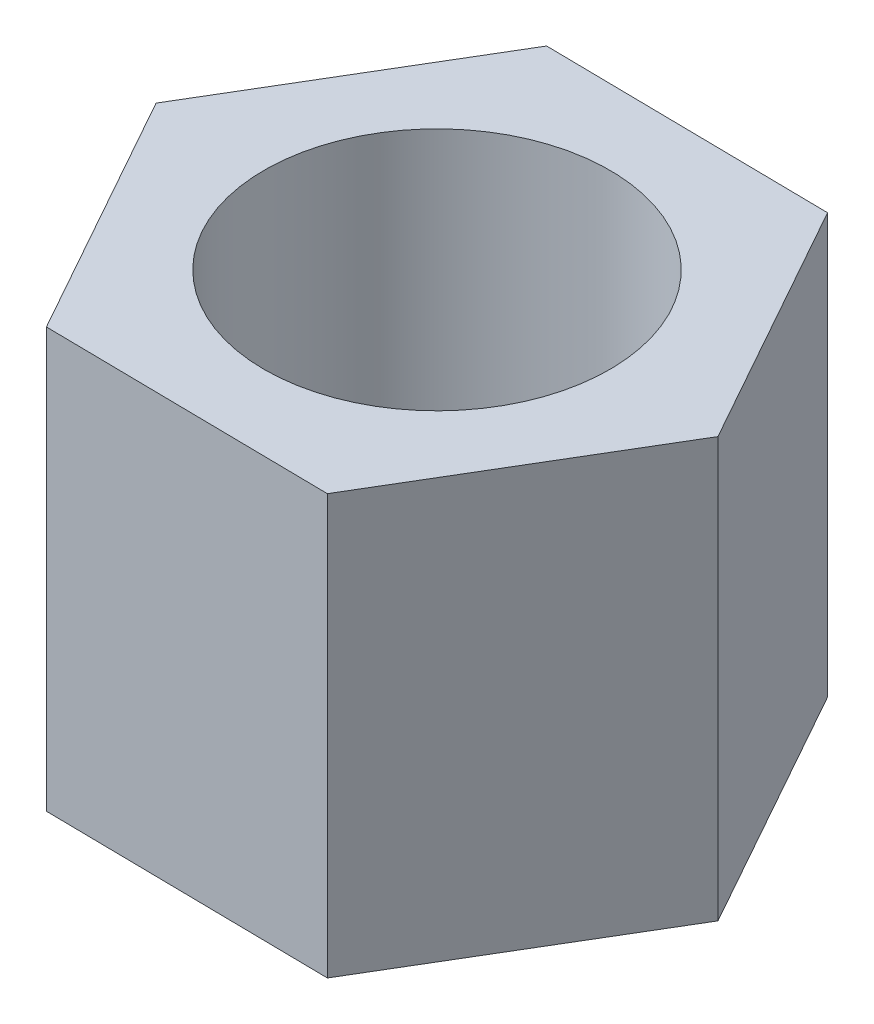
ISO-10303-21;
HEADER;
FILE_DESCRIPTION(('STEP AP214'),'2;1');
FILE_NAME('part.step','',(''),(''),'','','');
FILE_SCHEMA(('AUTOMOTIVE_DESIGN { 1 0 10303 214 1 1 1 1 }'));
ENDSEC;
DATA;
#1=APPLICATION_CONTEXT('core data for automotive mechanical design processes');
#2=APPLICATION_PROTOCOL_DEFINITION('international standard','automotive_design',2000,#1);
#3=PRODUCT_CONTEXT('',#1,'mechanical');
#4=PRODUCT('Part','Part','',(#3));
#5=PRODUCT_RELATED_PRODUCT_CATEGORY('part','',(#4));
#6=PRODUCT_DEFINITION_FORMATION('','',#4);
#7=PRODUCT_DEFINITION_CONTEXT('part definition',#1,'design');
#8=PRODUCT_DEFINITION('design','',#6,#7);
#9=PRODUCT_DEFINITION_SHAPE('','',#8);
#10=(LENGTH_UNIT() NAMED_UNIT(*) SI_UNIT(.MILLI.,.METRE.));
#11=(NAMED_UNIT(*) PLANE_ANGLE_UNIT() SI_UNIT($,.RADIAN.));
#12=(NAMED_UNIT(*) SI_UNIT($,.STERADIAN.) SOLID_ANGLE_UNIT());
#13=UNCERTAINTY_MEASURE_WITH_UNIT(LENGTH_MEASURE(1.E-05),#10,'distance_accuracy_value','');
#14=(GEOMETRIC_REPRESENTATION_CONTEXT(3) GLOBAL_UNCERTAINTY_ASSIGNED_CONTEXT((#13)) GLOBAL_UNIT_ASSIGNED_CONTEXT((#10,
#11,#12)) REPRESENTATION_CONTEXT('',''));
#15=CARTESIAN_POINT('',(0.,0.,0.));
#16=DIRECTION('',(0.,0.,1.));
#17=DIRECTION('',(1.,0.,0.));
#18=AXIS2_PLACEMENT_3D('',#15,#16,#17);
#19=CARTESIAN_POINT('',(-5.91090155943536,17.,9.91940401879054));
#20=DIRECTION('',(0.013794823423949,0.,-0.999904846896294));
#21=DIRECTION('',(-0.999904846896295,0.,-0.013794823423949));
#22=AXIS2_PLACEMENT_3D('',#19,#20,#21);
#23=PLANE('',#22);
#24=DIRECTION('',(0.999904846896295,0.,0.013794823423949));
#25=VECTOR('',#24,1.);
#26=CARTESIAN_POINT('',(-5.91090155943536,0.,9.91940401879054));
#27=LINE('',#26,#25);
#28=CARTESIAN_POINT('',(-5.91090155943536,0.,9.91940401879054));
#29=VERTEX_POINT('',#28);
#30=CARTESIAN_POINT('',(5.63500509095638,0.,10.0786929191353));
#31=VERTEX_POINT('',#30);
#32=EDGE_CURVE('E117',#29,#31,#27,.T.);
#33=ORIENTED_EDGE('',*,*,#32,.T.);
#34=DIRECTION('',(0.,-1.,0.));
#35=VECTOR('',#34,1.);
#36=CARTESIAN_POINT('',(5.63500509095638,17.,10.0786929191353));
#37=LINE('',#36,#35);
#38=CARTESIAN_POINT('',(5.63500509095638,17.,10.0786929191353));
#39=VERTEX_POINT('',#38);
#40=EDGE_CURVE('E11',#39,#31,#37,.T.);
#41=ORIENTED_EDGE('',*,*,#40,.F.);
#42=DIRECTION('',(0.999904846896295,0.,0.013794823423949));
#43=VECTOR('',#42,1.);
#44=CARTESIAN_POINT('',(-5.91090155943536,17.,9.91940401879054));
#45=LINE('',#44,#43);
#46=CARTESIAN_POINT('',(-5.91090155943536,17.,9.91940401879054));
#47=VERTEX_POINT('',#46);
#48=EDGE_CURVE('E128',#47,#39,#45,.T.);
#49=ORIENTED_EDGE('',*,*,#48,.F.);
#50=DIRECTION('',(0.,-1.,0.));
#51=VECTOR('',#50,1.);
#52=CARTESIAN_POINT('',(-5.91090155943536,17.,9.91940401879054));
#53=LINE('',#52,#51);
#54=EDGE_CURVE('E113',#47,#29,#53,.T.);
#55=ORIENTED_EDGE('',*,*,#54,.T.);
#56=EDGE_LOOP('',(#33,#41,#49,#55));
#57=FACE_BOUND('',#56,.T.);
#58=ADVANCED_FACE('F33',(#57),#23,.F.);
#59=CARTESIAN_POINT('',(5.63500509095638,17.,10.0786929191353));
#60=DIRECTION('',(-0.859045587067407,0.,-0.511899090974007));
#61=DIRECTION('',(-0.511899090974007,0.,0.859045587067407));
#62=AXIS2_PLACEMENT_3D('',#59,#60,#61);
#63=PLANE('',#62);
#64=DIRECTION('',(0.511899090974007,0.,-0.859045587067407));
#65=VECTOR('',#64,1.);
#66=CARTESIAN_POINT('',(5.63500509095638,0.,10.0786929191353));
#67=LINE('',#66,#65);
#68=CARTESIAN_POINT('',(11.5459066503917,0.,0.159288900344801));
#69=VERTEX_POINT('',#68);
#70=EDGE_CURVE('E120',#31,#69,#67,.T.);
#71=ORIENTED_EDGE('',*,*,#70,.T.);
#72=DIRECTION('',(0.,-1.,0.));
#73=VECTOR('',#72,1.);
#74=CARTESIAN_POINT('',(11.5459066503917,17.,0.159288900344801));
#75=LINE('',#74,#73);
#76=CARTESIAN_POINT('',(11.5459066503917,17.,0.159288900344801));
#77=VERTEX_POINT('',#76);
#78=EDGE_CURVE('E41',#77,#69,#75,.T.);
#79=ORIENTED_EDGE('',*,*,#78,.F.);
#80=DIRECTION('',(0.511899090974007,0.,-0.859045587067407));
#81=VECTOR('',#80,1.);
#82=CARTESIAN_POINT('',(5.63500509095638,17.,10.0786929191353));
#83=LINE('',#82,#81);
#84=EDGE_CURVE('E86',#39,#77,#83,.T.);
#85=ORIENTED_EDGE('',*,*,#84,.F.);
#86=ORIENTED_EDGE('',*,*,#40,.T.);
#87=EDGE_LOOP('',(#71,#79,#85,#86));
#88=FACE_BOUND('',#87,.T.);
#89=ADVANCED_FACE('F153',(#88),#63,.F.);
#90=CARTESIAN_POINT('',(11.5459066503917,17.,0.159288900344801));
#91=DIRECTION('',(-0.872840410491355,0.,0.488005755922287));
#92=DIRECTION('',(0.488005755922287,0.,0.872840410491355));
#93=AXIS2_PLACEMENT_3D('',#90,#91,#92);
#94=PLANE('',#93);
#95=DIRECTION('',(-0.488005755922287,0.,-0.872840410491355));
#96=VECTOR('',#95,1.);
#97=CARTESIAN_POINT('',(11.5459066503917,0.,0.159288900344801));
#98=LINE('',#97,#96);
#99=CARTESIAN_POINT('',(5.91090155943536,0.,-9.91940401879055));
#100=VERTEX_POINT('',#99);
#101=EDGE_CURVE('E123',#69,#100,#98,.T.);
#102=ORIENTED_EDGE('',*,*,#101,.T.);
#103=DIRECTION('',(0.,-1.,0.));
#104=VECTOR('',#103,1.);
#105=CARTESIAN_POINT('',(5.91090155943536,17.,-9.91940401879055));
#106=LINE('',#105,#104);
#107=CARTESIAN_POINT('',(5.91090155943536,17.,-9.91940401879055));
#108=VERTEX_POINT('',#107);
#109=EDGE_CURVE('E108',#108,#100,#106,.T.);
#110=ORIENTED_EDGE('',*,*,#109,.F.);
#111=DIRECTION('',(-0.488005755922287,0.,-0.872840410491355));
#112=VECTOR('',#111,1.);
#113=CARTESIAN_POINT('',(11.5459066503917,17.,0.159288900344801));
#114=LINE('',#113,#112);
#115=EDGE_CURVE('E99',#77,#108,#114,.T.);
#116=ORIENTED_EDGE('',*,*,#115,.F.);
#117=ORIENTED_EDGE('',*,*,#78,.T.);
#118=EDGE_LOOP('',(#102,#110,#116,#117));
#119=FACE_BOUND('',#118,.T.);
#120=ADVANCED_FACE('F134',(#119),#94,.F.);
#121=CARTESIAN_POINT('',(5.91090155943536,17.,-9.91940401879055));
#122=DIRECTION('',(-0.0137948234239488,0.,0.999904846896294));
#123=DIRECTION('',(0.999904846896295,0.,0.0137948234239488));
#124=AXIS2_PLACEMENT_3D('',#121,#122,#123);
#125=PLANE('',#124);
#126=DIRECTION('',(-0.999904846896295,0.,-0.0137948234239488));
#127=VECTOR('',#126,1.);
#128=CARTESIAN_POINT('',(5.91090155943536,0.,-9.91940401879055));
#129=LINE('',#128,#127);
#130=CARTESIAN_POINT('',(-5.63500509095639,0.,-10.0786929191354));
#131=VERTEX_POINT('',#130);
#132=EDGE_CURVE('E107',#100,#131,#129,.T.);
#133=ORIENTED_EDGE('',*,*,#132,.T.);
#134=DIRECTION('',(0.,-1.,0.));
#135=VECTOR('',#134,1.);
#136=CARTESIAN_POINT('',(-5.63500509095639,17.,-10.0786929191354));
#137=LINE('',#136,#135);
#138=CARTESIAN_POINT('',(-5.63500509095639,17.,-10.0786929191354));
#139=VERTEX_POINT('',#138);
#140=EDGE_CURVE('E104',#139,#131,#137,.T.);
#141=ORIENTED_EDGE('',*,*,#140,.F.);
#142=DIRECTION('',(-0.999904846896295,0.,-0.0137948234239488));
#143=VECTOR('',#142,1.);
#144=CARTESIAN_POINT('',(5.91090155943536,17.,-9.91940401879055));
#145=LINE('',#144,#143);
#146=EDGE_CURVE('E93',#108,#139,#145,.T.);
#147=ORIENTED_EDGE('',*,*,#146,.F.);
#148=ORIENTED_EDGE('',*,*,#109,.T.);
#149=EDGE_LOOP('',(#133,#141,#147,#148));
#150=FACE_BOUND('',#149,.T.);
#151=ADVANCED_FACE('F105',(#150),#125,.F.);
#152=CARTESIAN_POINT('',(-5.63500509095639,17.,-10.0786929191354));
#153=DIRECTION('',(0.859045587067406,0.,0.511899090974008));
#154=DIRECTION('',(0.511899090974008,0.,-0.859045587067406));
#155=AXIS2_PLACEMENT_3D('',#152,#153,#154);
#156=PLANE('',#155);
#157=DIRECTION('',(-0.511899090974008,0.,0.859045587067406));
#158=VECTOR('',#157,1.);
#159=CARTESIAN_POINT('',(-5.63500509095639,0.,-10.0786929191354));
#160=LINE('',#159,#158);
#161=CARTESIAN_POINT('',(-11.5459066503917,0.,-0.159288900344807));
#162=VERTEX_POINT('',#161);
#163=EDGE_CURVE('E72',#131,#162,#160,.T.);
#164=ORIENTED_EDGE('',*,*,#163,.T.);
#165=DIRECTION('',(0.,-1.,0.));
#166=VECTOR('',#165,1.);
#167=CARTESIAN_POINT('',(-11.5459066503917,17.,-0.159288900344807));
#168=LINE('',#167,#166);
#169=CARTESIAN_POINT('',(-11.5459066503917,17.,-0.159288900344807));
#170=VERTEX_POINT('',#169);
#171=EDGE_CURVE('E109',#170,#162,#168,.T.);
#172=ORIENTED_EDGE('',*,*,#171,.F.);
#173=DIRECTION('',(-0.511899090974008,0.,0.859045587067406));
#174=VECTOR('',#173,1.);
#175=CARTESIAN_POINT('',(-5.63500509095639,17.,-10.0786929191354));
#176=LINE('',#175,#174);
#177=EDGE_CURVE('E97',#139,#170,#176,.T.);
#178=ORIENTED_EDGE('',*,*,#177,.F.);
#179=ORIENTED_EDGE('',*,*,#140,.T.);
#180=EDGE_LOOP('',(#164,#172,#178,#179));
#181=FACE_BOUND('',#180,.T.);
#182=ADVANCED_FACE('F111',(#181),#156,.F.);
#183=CARTESIAN_POINT('',(-11.5459066503917,17.,-0.159288900344807));
#184=DIRECTION('',(0.872840410491355,0.,-0.488005755922287));
#185=DIRECTION('',(-0.488005755922287,0.,-0.872840410491355));
#186=AXIS2_PLACEMENT_3D('',#183,#184,#185);
#187=PLANE('',#186);
#188=DIRECTION('',(0.488005755922287,0.,0.872840410491355));
#189=VECTOR('',#188,1.);
#190=CARTESIAN_POINT('',(-11.5459066503917,0.,-0.159288900344807));
#191=LINE('',#190,#189);
#192=EDGE_CURVE('E78',#162,#29,#191,.T.);
#193=ORIENTED_EDGE('',*,*,#192,.T.);
#194=ORIENTED_EDGE('',*,*,#54,.F.);
#195=DIRECTION('',(0.488005755922287,0.,0.872840410491355));
#196=VECTOR('',#195,1.);
#197=CARTESIAN_POINT('',(-11.5459066503917,17.,-0.159288900344807));
#198=LINE('',#197,#196);
#199=EDGE_CURVE('E49',#170,#47,#198,.T.);
#200=ORIENTED_EDGE('',*,*,#199,.F.);
#201=ORIENTED_EDGE('',*,*,#171,.T.);
#202=EDGE_LOOP('',(#193,#194,#200,#201));
#203=FACE_BOUND('',#202,.T.);
#204=ADVANCED_FACE('F141',(#203),#187,.F.);
#205=CARTESIAN_POINT('',(0.,17.,0.));
#206=DIRECTION('',(0.,1.,0.));
#207=DIRECTION('',(0.,0.,1.));
#208=AXIS2_PLACEMENT_3D('',#205,#206,#207);
#209=PLANE('',#208);
#210=CARTESIAN_POINT('',(0.,17.,0.));
#211=DIRECTION('',(0.,1.,0.));
#212=DIRECTION('',(0.,0.,1.));
#213=AXIS2_PLACEMENT_3D('',#210,#211,#212);
#214=CIRCLE('',#213,7.);
#215=CARTESIAN_POINT('',(0.,17.,7.));
#216=VERTEX_POINT('',#215);
#217=EDGE_CURVE('E214',#216,#216,#214,.T.);
#218=ORIENTED_EDGE('',*,*,#217,.F.);
#219=EDGE_LOOP('',(#218));
#220=FACE_BOUND('',#219,.T.);
#221=ORIENTED_EDGE('',*,*,#48,.T.);
#222=ORIENTED_EDGE('',*,*,#84,.T.);
#223=ORIENTED_EDGE('',*,*,#115,.T.);
#224=ORIENTED_EDGE('',*,*,#146,.T.);
#225=ORIENTED_EDGE('',*,*,#177,.T.);
#226=ORIENTED_EDGE('',*,*,#199,.T.);
#227=EDGE_LOOP('',(#221,#222,#223,#224,#225,#226));
#228=FACE_BOUND('',#227,.T.);
#229=ADVANCED_FACE('F95',(#220,#228),#209,.T.);
#230=CARTESIAN_POINT('',(0.,0.,0.));
#231=DIRECTION('',(0.,1.,0.));
#232=DIRECTION('',(0.,0.,1.));
#233=AXIS2_PLACEMENT_3D('',#230,#231,#232);
#234=PLANE('',#233);
#235=ORIENTED_EDGE('',*,*,#32,.F.);
#236=ORIENTED_EDGE('',*,*,#192,.F.);
#237=ORIENTED_EDGE('',*,*,#163,.F.);
#238=ORIENTED_EDGE('',*,*,#132,.F.);
#239=ORIENTED_EDGE('',*,*,#101,.F.);
#240=ORIENTED_EDGE('',*,*,#70,.F.);
#241=EDGE_LOOP('',(#235,#236,#237,#238,#239,#240));
#242=FACE_BOUND('',#241,.T.);
#243=ADVANCED_FACE('F137',(#242),#234,.F.);
#244=CARTESIAN_POINT('',(0.,7.,0.));
#245=DIRECTION('',(0.,1.,0.));
#246=DIRECTION('',(0.,0.,1.));
#247=AXIS2_PLACEMENT_3D('',#244,#245,#246);
#248=CYLINDRICAL_SURFACE('',#247,7.);
#249=CARTESIAN_POINT('',(0.,7.,0.));
#250=DIRECTION('',(0.,1.,0.));
#251=DIRECTION('',(0.,0.,1.));
#252=AXIS2_PLACEMENT_3D('',#249,#250,#251);
#253=CIRCLE('',#252,7.);
#254=CARTESIAN_POINT('',(0.,7.,7.));
#255=VERTEX_POINT('',#254);
#256=EDGE_CURVE('E121',#255,#255,#253,.T.);
#257=ORIENTED_EDGE('',*,*,#256,.F.);
#258=EDGE_LOOP('',(#257));
#259=FACE_BOUND('',#258,.T.);
#260=ORIENTED_EDGE('',*,*,#217,.T.);
#261=EDGE_LOOP('',(#260));
#262=FACE_BOUND('',#261,.T.);
#263=ADVANCED_FACE('F185',(#259,#262),#248,.F.);
#264=CARTESIAN_POINT('',(0.,7.,0.));
#265=DIRECTION('',(0.,1.,0.));
#266=DIRECTION('',(0.,0.,1.));
#267=AXIS2_PLACEMENT_3D('',#264,#265,#266);
#268=PLANE('',#267);
#269=ORIENTED_EDGE('',*,*,#256,.T.);
#270=EDGE_LOOP('',(#269));
#271=FACE_BOUND('',#270,.T.);
#272=ADVANCED_FACE('F198',(#271),#268,.T.);
#273=CLOSED_SHELL('',(#58,#89,#120,#151,#182,#204,#229,#243,#263,#272));
#274=MANIFOLD_SOLID_BREP('B2',#273);
#275=ADVANCED_BREP_SHAPE_REPRESENTATION('',(#18,#274),#14);
#276=SHAPE_DEFINITION_REPRESENTATION(#9,#275);
ENDSEC;
END-ISO-10303-21;
